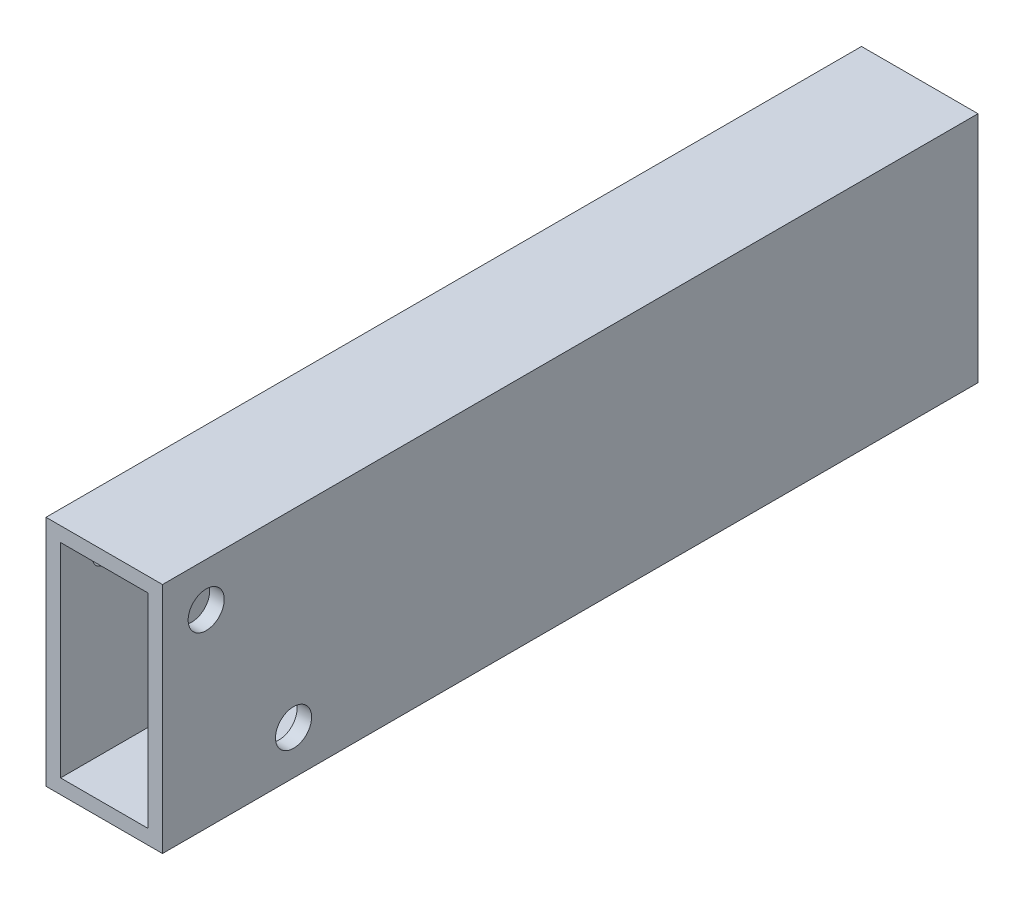
ISO-10303-21;
HEADER;
FILE_DESCRIPTION(('STEP AP214'),'2;1');
FILE_NAME('part.step','',(''),(''),'','','');
FILE_SCHEMA(('AUTOMOTIVE_DESIGN { 1 0 10303 214 1 1 1 1 }'));
ENDSEC;
DATA;
#1=APPLICATION_CONTEXT('core data for automotive mechanical design processes');
#2=APPLICATION_PROTOCOL_DEFINITION('international standard','automotive_design',2000,#1);
#3=PRODUCT_CONTEXT('',#1,'mechanical');
#4=PRODUCT('Part','Part','',(#3));
#5=PRODUCT_RELATED_PRODUCT_CATEGORY('part','',(#4));
#6=PRODUCT_DEFINITION_FORMATION('','',#4);
#7=PRODUCT_DEFINITION_CONTEXT('part definition',#1,'design');
#8=PRODUCT_DEFINITION('design','',#6,#7);
#9=PRODUCT_DEFINITION_SHAPE('','',#8);
#10=(LENGTH_UNIT() NAMED_UNIT(*) SI_UNIT(.MILLI.,.METRE.));
#11=(NAMED_UNIT(*) PLANE_ANGLE_UNIT() SI_UNIT($,.RADIAN.));
#12=(NAMED_UNIT(*) SI_UNIT($,.STERADIAN.) SOLID_ANGLE_UNIT());
#13=UNCERTAINTY_MEASURE_WITH_UNIT(LENGTH_MEASURE(1.E-05),#10,'distance_accuracy_value','');
#14=(GEOMETRIC_REPRESENTATION_CONTEXT(3) GLOBAL_UNCERTAINTY_ASSIGNED_CONTEXT((#13)) GLOBAL_UNIT_ASSIGNED_CONTEXT((#10,
#11,#12)) REPRESENTATION_CONTEXT('',''));
#15=CARTESIAN_POINT('',(0.,0.,0.));
#16=DIRECTION('',(0.,0.,1.));
#17=DIRECTION('',(1.,0.,0.));
#18=AXIS2_PLACEMENT_3D('',#15,#16,#17);
#19=CARTESIAN_POINT('',(0.,0.,177.8));
#20=DIRECTION('',(0.,0.,-1.));
#21=DIRECTION('',(-1.,0.,0.));
#22=AXIS2_PLACEMENT_3D('',#19,#20,#21);
#23=PLANE('',#22);
#24=DIRECTION('',(0.,1.,0.));
#25=VECTOR('',#24,1.);
#26=CARTESIAN_POINT('',(12.7,-25.4,177.8));
#27=LINE('',#26,#25);
#28=CARTESIAN_POINT('',(12.7,-25.4,177.8));
#29=VERTEX_POINT('',#28);
#30=CARTESIAN_POINT('',(12.7,25.4,177.8));
#31=VERTEX_POINT('',#30);
#32=EDGE_CURVE('E135',#29,#31,#27,.T.);
#33=ORIENTED_EDGE('',*,*,#32,.T.);
#34=DIRECTION('',(-1.,0.,0.));
#35=VECTOR('',#34,1.);
#36=CARTESIAN_POINT('',(-12.7,25.4,177.8));
#37=LINE('',#36,#35);
#38=CARTESIAN_POINT('',(-12.7,25.4,177.8));
#39=VERTEX_POINT('',#38);
#40=EDGE_CURVE('E138',#31,#39,#37,.T.);
#41=ORIENTED_EDGE('',*,*,#40,.T.);
#42=DIRECTION('',(0.,-1.,0.));
#43=VECTOR('',#42,1.);
#44=CARTESIAN_POINT('',(-12.7,-25.4,177.8));
#45=LINE('',#44,#43);
#46=CARTESIAN_POINT('',(-12.7,-25.4,177.8));
#47=VERTEX_POINT('',#46);
#48=EDGE_CURVE('E141',#39,#47,#45,.T.);
#49=ORIENTED_EDGE('',*,*,#48,.T.);
#50=DIRECTION('',(1.,0.,0.));
#51=VECTOR('',#50,1.);
#52=CARTESIAN_POINT('',(-12.7,-25.4,177.8));
#53=LINE('',#52,#51);
#54=EDGE_CURVE('E143',#47,#29,#53,.T.);
#55=ORIENTED_EDGE('',*,*,#54,.T.);
#56=EDGE_LOOP('',(#33,#41,#49,#55));
#57=FACE_BOUND('',#56,.T.);
#58=DIRECTION('',(0.,-1.,0.));
#59=VECTOR('',#58,1.);
#60=CARTESIAN_POINT('',(-9.525,-22.225,177.8));
#61=LINE('',#60,#59);
#62=CARTESIAN_POINT('',(-9.525,22.225,177.8));
#63=VERTEX_POINT('',#62);
#64=CARTESIAN_POINT('',(-9.525,-22.225,177.8));
#65=VERTEX_POINT('',#64);
#66=EDGE_CURVE('E97',#63,#65,#61,.T.);
#67=ORIENTED_EDGE('',*,*,#66,.F.);
#68=DIRECTION('',(-1.,0.,0.));
#69=VECTOR('',#68,1.);
#70=CARTESIAN_POINT('',(-9.525,22.225,177.8));
#71=LINE('',#70,#69);
#72=CARTESIAN_POINT('',(9.525,22.225,177.8));
#73=VERTEX_POINT('',#72);
#74=EDGE_CURVE('E119',#73,#63,#71,.T.);
#75=ORIENTED_EDGE('',*,*,#74,.F.);
#76=DIRECTION('',(0.,1.,0.));
#77=VECTOR('',#76,1.);
#78=CARTESIAN_POINT('',(9.525,-22.225,177.8));
#79=LINE('',#78,#77);
#80=CARTESIAN_POINT('',(9.525,-22.225,177.8));
#81=VERTEX_POINT('',#80);
#82=EDGE_CURVE('E117',#81,#73,#79,.T.);
#83=ORIENTED_EDGE('',*,*,#82,.F.);
#84=DIRECTION('',(1.,0.,0.));
#85=VECTOR('',#84,1.);
#86=CARTESIAN_POINT('',(-9.525,-22.225,177.8));
#87=LINE('',#86,#85);
#88=EDGE_CURVE('E105',#65,#81,#87,.T.);
#89=ORIENTED_EDGE('',*,*,#88,.F.);
#90=EDGE_LOOP('',(#67,#75,#83,#89));
#91=FACE_BOUND('',#90,.T.);
#92=ADVANCED_FACE('F32',(#57,#91),#23,.F.);
#93=CARTESIAN_POINT('',(0.,0.,0.));
#94=DIRECTION('',(0.,0.,-1.));
#95=DIRECTION('',(-1.,0.,0.));
#96=AXIS2_PLACEMENT_3D('',#93,#94,#95);
#97=PLANE('',#96);
#98=DIRECTION('',(0.,1.,0.));
#99=VECTOR('',#98,1.);
#100=CARTESIAN_POINT('',(12.7,-25.4,0.));
#101=LINE('',#100,#99);
#102=CARTESIAN_POINT('',(12.7,-25.4,0.));
#103=VERTEX_POINT('',#102);
#104=CARTESIAN_POINT('',(12.7,25.4,0.));
#105=VERTEX_POINT('',#104);
#106=EDGE_CURVE('E113',#103,#105,#101,.T.);
#107=ORIENTED_EDGE('',*,*,#106,.F.);
#108=DIRECTION('',(1.,0.,0.));
#109=VECTOR('',#108,1.);
#110=CARTESIAN_POINT('',(-12.7,-25.4,0.));
#111=LINE('',#110,#109);
#112=CARTESIAN_POINT('',(-12.7,-25.4,0.));
#113=VERTEX_POINT('',#112);
#114=EDGE_CURVE('E139',#113,#103,#111,.T.);
#115=ORIENTED_EDGE('',*,*,#114,.F.);
#116=DIRECTION('',(0.,-1.,0.));
#117=VECTOR('',#116,1.);
#118=CARTESIAN_POINT('',(-12.7,-25.4,0.));
#119=LINE('',#118,#117);
#120=CARTESIAN_POINT('',(-12.7,25.4,0.));
#121=VERTEX_POINT('',#120);
#122=EDGE_CURVE('E150',#121,#113,#119,.T.);
#123=ORIENTED_EDGE('',*,*,#122,.F.);
#124=DIRECTION('',(-1.,0.,0.));
#125=VECTOR('',#124,1.);
#126=CARTESIAN_POINT('',(-12.7,25.4,0.));
#127=LINE('',#126,#125);
#128=EDGE_CURVE('E148',#105,#121,#127,.T.);
#129=ORIENTED_EDGE('',*,*,#128,.F.);
#130=EDGE_LOOP('',(#107,#115,#123,#129));
#131=FACE_BOUND('',#130,.T.);
#132=DIRECTION('',(-1.,0.,0.));
#133=VECTOR('',#132,1.);
#134=CARTESIAN_POINT('',(-9.525,22.225,0.));
#135=LINE('',#134,#133);
#136=CARTESIAN_POINT('',(9.525,22.225,0.));
#137=VERTEX_POINT('',#136);
#138=CARTESIAN_POINT('',(-9.525,22.225,0.));
#139=VERTEX_POINT('',#138);
#140=EDGE_CURVE('E106',#137,#139,#135,.T.);
#141=ORIENTED_EDGE('',*,*,#140,.T.);
#142=DIRECTION('',(0.,-1.,0.));
#143=VECTOR('',#142,1.);
#144=CARTESIAN_POINT('',(-9.525,-22.225,0.));
#145=LINE('',#144,#143);
#146=CARTESIAN_POINT('',(-9.525,-22.225,0.));
#147=VERTEX_POINT('',#146);
#148=EDGE_CURVE('E55',#139,#147,#145,.T.);
#149=ORIENTED_EDGE('',*,*,#148,.T.);
#150=DIRECTION('',(1.,0.,0.));
#151=VECTOR('',#150,1.);
#152=CARTESIAN_POINT('',(-9.525,-22.225,0.));
#153=LINE('',#152,#151);
#154=CARTESIAN_POINT('',(9.525,-22.225,0.));
#155=VERTEX_POINT('',#154);
#156=EDGE_CURVE('E112',#147,#155,#153,.T.);
#157=ORIENTED_EDGE('',*,*,#156,.T.);
#158=DIRECTION('',(0.,1.,0.));
#159=VECTOR('',#158,1.);
#160=CARTESIAN_POINT('',(9.525,-22.225,0.));
#161=LINE('',#160,#159);
#162=EDGE_CURVE('E127',#155,#137,#161,.T.);
#163=ORIENTED_EDGE('',*,*,#162,.T.);
#164=EDGE_LOOP('',(#141,#149,#157,#163));
#165=FACE_BOUND('',#164,.T.);
#166=ADVANCED_FACE('F168',(#131,#165),#97,.T.);
#167=CARTESIAN_POINT('',(12.7,-25.4,177.8));
#168=DIRECTION('',(-1.,0.,0.));
#169=DIRECTION('',(0.,0.,1.));
#170=AXIS2_PLACEMENT_3D('',#167,#168,#169);
#171=PLANE('',#170);
#172=CARTESIAN_POINT('',(12.7,-15.875,149.225));
#173=DIRECTION('',(1.,0.,0.));
#174=DIRECTION('',(0.,0.,-1.));
#175=AXIS2_PLACEMENT_3D('',#172,#173,#174);
#176=CIRCLE('',#175,3.937);
#177=CARTESIAN_POINT('',(12.7,-15.875,145.288));
#178=VERTEX_POINT('',#177);
#179=EDGE_CURVE('E224',#178,#178,#176,.T.);
#180=ORIENTED_EDGE('',*,*,#179,.F.);
#181=EDGE_LOOP('',(#180));
#182=FACE_BOUND('',#181,.T.);
#183=CARTESIAN_POINT('',(12.7,15.875,168.275));
#184=DIRECTION('',(1.,0.,0.));
#185=DIRECTION('',(0.,0.,-1.));
#186=AXIS2_PLACEMENT_3D('',#183,#184,#185);
#187=CIRCLE('',#186,3.937);
#188=CARTESIAN_POINT('',(12.7,15.875,164.338));
#189=VERTEX_POINT('',#188);
#190=EDGE_CURVE('E220',#189,#189,#187,.T.);
#191=ORIENTED_EDGE('',*,*,#190,.F.);
#192=EDGE_LOOP('',(#191));
#193=FACE_BOUND('',#192,.T.);
#194=ORIENTED_EDGE('',*,*,#106,.T.);
#195=DIRECTION('',(0.,0.,-1.));
#196=VECTOR('',#195,1.);
#197=CARTESIAN_POINT('',(12.7,25.4,177.8));
#198=LINE('',#197,#196);
#199=EDGE_CURVE('E11',#31,#105,#198,.T.);
#200=ORIENTED_EDGE('',*,*,#199,.F.);
#201=ORIENTED_EDGE('',*,*,#32,.F.);
#202=DIRECTION('',(0.,0.,-1.));
#203=VECTOR('',#202,1.);
#204=CARTESIAN_POINT('',(12.7,-25.4,177.8));
#205=LINE('',#204,#203);
#206=EDGE_CURVE('E145',#29,#103,#205,.T.);
#207=ORIENTED_EDGE('',*,*,#206,.T.);
#208=EDGE_LOOP('',(#194,#200,#201,#207));
#209=FACE_BOUND('',#208,.T.);
#210=ADVANCED_FACE('F34',(#182,#193,#209),#171,.F.);
#211=CARTESIAN_POINT('',(-12.7,25.4,177.8));
#212=DIRECTION('',(0.,-1.,0.));
#213=DIRECTION('',(0.,0.,-1.));
#214=AXIS2_PLACEMENT_3D('',#211,#212,#213);
#215=PLANE('',#214);
#216=ORIENTED_EDGE('',*,*,#128,.T.);
#217=DIRECTION('',(0.,0.,-1.));
#218=VECTOR('',#217,1.);
#219=CARTESIAN_POINT('',(-12.7,25.4,177.8));
#220=LINE('',#219,#218);
#221=EDGE_CURVE('E40',#39,#121,#220,.T.);
#222=ORIENTED_EDGE('',*,*,#221,.F.);
#223=ORIENTED_EDGE('',*,*,#40,.F.);
#224=ORIENTED_EDGE('',*,*,#199,.T.);
#225=EDGE_LOOP('',(#216,#222,#223,#224));
#226=FACE_BOUND('',#225,.T.);
#227=ADVANCED_FACE('F178',(#226),#215,.F.);
#228=CARTESIAN_POINT('',(-12.7,-25.4,177.8));
#229=DIRECTION('',(1.,0.,0.));
#230=DIRECTION('',(0.,0.,-1.));
#231=AXIS2_PLACEMENT_3D('',#228,#229,#230);
#232=PLANE('',#231);
#233=CARTESIAN_POINT('',(-12.7,-15.875,149.225));
#234=DIRECTION('',(1.,0.,0.));
#235=DIRECTION('',(0.,0.,-1.));
#236=AXIS2_PLACEMENT_3D('',#233,#234,#235);
#237=CIRCLE('',#236,2.57968750000001);
#238=CARTESIAN_POINT('',(-12.7,-15.875,146.6453125));
#239=VERTEX_POINT('',#238);
#240=EDGE_CURVE('E217',#239,#239,#237,.T.);
#241=ORIENTED_EDGE('',*,*,#240,.T.);
#242=EDGE_LOOP('',(#241));
#243=FACE_BOUND('',#242,.T.);
#244=CARTESIAN_POINT('',(-12.7,15.875,168.275));
#245=DIRECTION('',(1.,0.,0.));
#246=DIRECTION('',(0.,0.,-1.));
#247=AXIS2_PLACEMENT_3D('',#244,#245,#246);
#248=CIRCLE('',#247,2.57968750000001);
#249=CARTESIAN_POINT('',(-12.7,15.875,165.6953125));
#250=VERTEX_POINT('',#249);
#251=EDGE_CURVE('E212',#250,#250,#248,.T.);
#252=ORIENTED_EDGE('',*,*,#251,.T.);
#253=EDGE_LOOP('',(#252));
#254=FACE_BOUND('',#253,.T.);
#255=ORIENTED_EDGE('',*,*,#122,.T.);
#256=DIRECTION('',(0.,0.,-1.));
#257=VECTOR('',#256,1.);
#258=CARTESIAN_POINT('',(-12.7,-25.4,177.8));
#259=LINE('',#258,#257);
#260=EDGE_CURVE('E155',#47,#113,#259,.T.);
#261=ORIENTED_EDGE('',*,*,#260,.F.);
#262=ORIENTED_EDGE('',*,*,#48,.F.);
#263=ORIENTED_EDGE('',*,*,#221,.T.);
#264=EDGE_LOOP('',(#255,#261,#262,#263));
#265=FACE_BOUND('',#264,.T.);
#266=ADVANCED_FACE('F162',(#243,#254,#265),#232,.F.);
#267=CARTESIAN_POINT('',(-12.7,-25.4,177.8));
#268=DIRECTION('',(0.,1.,0.));
#269=DIRECTION('',(0.,0.,1.));
#270=AXIS2_PLACEMENT_3D('',#267,#268,#269);
#271=PLANE('',#270);
#272=ORIENTED_EDGE('',*,*,#114,.T.);
#273=ORIENTED_EDGE('',*,*,#206,.F.);
#274=ORIENTED_EDGE('',*,*,#54,.F.);
#275=ORIENTED_EDGE('',*,*,#260,.T.);
#276=EDGE_LOOP('',(#272,#273,#274,#275));
#277=FACE_BOUND('',#276,.T.);
#278=ADVANCED_FACE('F172',(#277),#271,.F.);
#279=CARTESIAN_POINT('',(-9.525,-22.225,177.8));
#280=DIRECTION('',(1.,0.,0.));
#281=DIRECTION('',(0.,0.,-1.));
#282=AXIS2_PLACEMENT_3D('',#279,#280,#281);
#283=PLANE('',#282);
#284=CARTESIAN_POINT('',(-9.525,-15.875,149.225));
#285=DIRECTION('',(1.,0.,0.));
#286=DIRECTION('',(0.,0.,-1.));
#287=AXIS2_PLACEMENT_3D('',#284,#285,#286);
#288=CIRCLE('',#287,2.57968750000001);
#289=CARTESIAN_POINT('',(-9.525,-15.875,146.6453125));
#290=VERTEX_POINT('',#289);
#291=EDGE_CURVE('E208',#290,#290,#288,.T.);
#292=ORIENTED_EDGE('',*,*,#291,.F.);
#293=EDGE_LOOP('',(#292));
#294=FACE_BOUND('',#293,.T.);
#295=CARTESIAN_POINT('',(-9.525,15.875,168.275));
#296=DIRECTION('',(1.,0.,0.));
#297=DIRECTION('',(0.,0.,-1.));
#298=AXIS2_PLACEMENT_3D('',#295,#296,#297);
#299=CIRCLE('',#298,2.57968750000001);
#300=CARTESIAN_POINT('',(-9.525,15.875,165.6953125));
#301=VERTEX_POINT('',#300);
#302=EDGE_CURVE('E125',#301,#301,#299,.T.);
#303=ORIENTED_EDGE('',*,*,#302,.F.);
#304=EDGE_LOOP('',(#303));
#305=FACE_BOUND('',#304,.T.);
#306=ORIENTED_EDGE('',*,*,#148,.F.);
#307=DIRECTION('',(0.,0.,-1.));
#308=VECTOR('',#307,1.);
#309=CARTESIAN_POINT('',(-9.525,22.225,177.8));
#310=LINE('',#309,#308);
#311=EDGE_CURVE('E101',#63,#139,#310,.T.);
#312=ORIENTED_EDGE('',*,*,#311,.F.);
#313=ORIENTED_EDGE('',*,*,#66,.T.);
#314=DIRECTION('',(0.,0.,-1.));
#315=VECTOR('',#314,1.);
#316=CARTESIAN_POINT('',(-9.525,-22.225,177.8));
#317=LINE('',#316,#315);
#318=EDGE_CURVE('E100',#65,#147,#317,.T.);
#319=ORIENTED_EDGE('',*,*,#318,.T.);
#320=EDGE_LOOP('',(#306,#312,#313,#319));
#321=FACE_BOUND('',#320,.T.);
#322=ADVANCED_FACE('F99',(#294,#305,#321),#283,.T.);
#323=CARTESIAN_POINT('',(-9.525,-22.225,177.8));
#324=DIRECTION('',(0.,1.,0.));
#325=DIRECTION('',(0.,0.,1.));
#326=AXIS2_PLACEMENT_3D('',#323,#324,#325);
#327=PLANE('',#326);
#328=ORIENTED_EDGE('',*,*,#156,.F.);
#329=ORIENTED_EDGE('',*,*,#318,.F.);
#330=ORIENTED_EDGE('',*,*,#88,.T.);
#331=DIRECTION('',(0.,0.,-1.));
#332=VECTOR('',#331,1.);
#333=CARTESIAN_POINT('',(9.525,-22.225,177.8));
#334=LINE('',#333,#332);
#335=EDGE_CURVE('E114',#81,#155,#334,.T.);
#336=ORIENTED_EDGE('',*,*,#335,.T.);
#337=EDGE_LOOP('',(#328,#329,#330,#336));
#338=FACE_BOUND('',#337,.T.);
#339=ADVANCED_FACE('F109',(#338),#327,.T.);
#340=CARTESIAN_POINT('',(9.525,-22.225,177.8));
#341=DIRECTION('',(-1.,0.,0.));
#342=DIRECTION('',(0.,0.,1.));
#343=AXIS2_PLACEMENT_3D('',#340,#341,#342);
#344=PLANE('',#343);
#345=CARTESIAN_POINT('',(9.525,-15.875,149.225));
#346=DIRECTION('',(-1.,0.,0.));
#347=DIRECTION('',(0.,0.,1.));
#348=AXIS2_PLACEMENT_3D('',#345,#346,#347);
#349=CIRCLE('',#348,3.937);
#350=CARTESIAN_POINT('',(9.525,-15.875,145.288));
#351=VERTEX_POINT('',#350);
#352=EDGE_CURVE('E227',#351,#351,#349,.F.);
#353=ORIENTED_EDGE('',*,*,#352,.T.);
#354=EDGE_LOOP('',(#353));
#355=FACE_BOUND('',#354,.T.);
#356=CARTESIAN_POINT('',(9.525,15.875,168.275));
#357=DIRECTION('',(-1.,0.,0.));
#358=DIRECTION('',(0.,0.,1.));
#359=AXIS2_PLACEMENT_3D('',#356,#357,#358);
#360=CIRCLE('',#359,3.937);
#361=CARTESIAN_POINT('',(9.525,15.875,164.338));
#362=VERTEX_POINT('',#361);
#363=EDGE_CURVE('E221',#362,#362,#360,.F.);
#364=ORIENTED_EDGE('',*,*,#363,.T.);
#365=EDGE_LOOP('',(#364));
#366=FACE_BOUND('',#365,.T.);
#367=ORIENTED_EDGE('',*,*,#162,.F.);
#368=ORIENTED_EDGE('',*,*,#335,.F.);
#369=ORIENTED_EDGE('',*,*,#82,.T.);
#370=DIRECTION('',(0.,0.,-1.));
#371=VECTOR('',#370,1.);
#372=CARTESIAN_POINT('',(9.525,22.225,177.8));
#373=LINE('',#372,#371);
#374=EDGE_CURVE('E47',#73,#137,#373,.T.);
#375=ORIENTED_EDGE('',*,*,#374,.T.);
#376=EDGE_LOOP('',(#367,#368,#369,#375));
#377=FACE_BOUND('',#376,.T.);
#378=ADVANCED_FACE('F204',(#355,#366,#377),#344,.T.);
#379=CARTESIAN_POINT('',(-9.525,22.225,177.8));
#380=DIRECTION('',(0.,-1.,0.));
#381=DIRECTION('',(1.,0.,0.));
#382=AXIS2_PLACEMENT_3D('',#379,#380,#381);
#383=PLANE('',#382);
#384=ORIENTED_EDGE('',*,*,#140,.F.);
#385=ORIENTED_EDGE('',*,*,#374,.F.);
#386=ORIENTED_EDGE('',*,*,#74,.T.);
#387=ORIENTED_EDGE('',*,*,#311,.T.);
#388=EDGE_LOOP('',(#384,#385,#386,#387));
#389=FACE_BOUND('',#388,.T.);
#390=ADVANCED_FACE('F255',(#389),#383,.T.);
#391=CARTESIAN_POINT('',(-12.7,15.875,168.275));
#392=DIRECTION('',(1.,0.,0.));
#393=DIRECTION('',(0.,0.,-1.));
#394=AXIS2_PLACEMENT_3D('',#391,#392,#393);
#395=CYLINDRICAL_SURFACE('',#394,2.57968750000001);
#396=ORIENTED_EDGE('',*,*,#302,.T.);
#397=EDGE_LOOP('',(#396));
#398=FACE_BOUND('',#397,.T.);
#399=ORIENTED_EDGE('',*,*,#251,.F.);
#400=EDGE_LOOP('',(#399));
#401=FACE_BOUND('',#400,.T.);
#402=ADVANCED_FACE('F248',(#398,#401),#395,.F.);
#403=CARTESIAN_POINT('',(-12.7,-15.875,149.225));
#404=DIRECTION('',(1.,0.,0.));
#405=DIRECTION('',(0.,0.,-1.));
#406=AXIS2_PLACEMENT_3D('',#403,#404,#405);
#407=CYLINDRICAL_SURFACE('',#406,2.57968750000001);
#408=ORIENTED_EDGE('',*,*,#291,.T.);
#409=EDGE_LOOP('',(#408));
#410=FACE_BOUND('',#409,.T.);
#411=ORIENTED_EDGE('',*,*,#240,.F.);
#412=EDGE_LOOP('',(#411));
#413=FACE_BOUND('',#412,.T.);
#414=ADVANCED_FACE('F239',(#410,#413),#407,.F.);
#415=CARTESIAN_POINT('',(-12.701,15.875,168.275));
#416=DIRECTION('',(1.,0.,0.));
#417=DIRECTION('',(0.,0.,-1.));
#418=AXIS2_PLACEMENT_3D('',#415,#416,#417);
#419=CYLINDRICAL_SURFACE('',#418,3.937);
#420=CARTESIAN_POINT('',(9.525,15.875,164.338));
#421=CARTESIAN_POINT('',(9.55807291666667,15.875,164.338));
#422=CARTESIAN_POINT('',(9.59114583333333,15.875,164.338));
#423=CARTESIAN_POINT('',(9.65729166666667,15.875,164.338));
#424=CARTESIAN_POINT('',(9.69036458333333,15.875,164.338));
#425=CARTESIAN_POINT('',(9.75651041666666,15.875,164.338));
#426=CARTESIAN_POINT('',(9.78958333333333,15.875,164.338));
#427=CARTESIAN_POINT('',(9.85572916666666,15.875,164.338));
#428=CARTESIAN_POINT('',(9.88880208333333,15.875,164.338));
#429=CARTESIAN_POINT('',(9.95494791666666,15.875,164.338));
#430=CARTESIAN_POINT('',(9.98802083333333,15.875,164.338));
#431=CARTESIAN_POINT('',(10.0541666666667,15.875,164.338));
#432=CARTESIAN_POINT('',(10.0872395833333,15.875,164.338));
#433=CARTESIAN_POINT('',(10.1533854166667,15.875,164.338));
#434=CARTESIAN_POINT('',(10.1864583333333,15.875,164.338));
#435=CARTESIAN_POINT('',(10.2526041666667,15.875,164.338));
#436=CARTESIAN_POINT('',(10.2856770833333,15.875,164.338));
#437=CARTESIAN_POINT('',(10.3518229166667,15.875,164.338));
#438=CARTESIAN_POINT('',(10.3848958333333,15.875,164.338));
#439=CARTESIAN_POINT('',(10.4510416666667,15.875,164.338));
#440=CARTESIAN_POINT('',(10.4841145833333,15.875,164.338));
#441=CARTESIAN_POINT('',(10.5502604166667,15.875,164.338));
#442=CARTESIAN_POINT('',(10.5833333333333,15.875,164.338));
#443=CARTESIAN_POINT('',(10.6494791666667,15.875,164.338));
#444=CARTESIAN_POINT('',(10.6825520833333,15.875,164.338));
#445=CARTESIAN_POINT('',(10.7486979166667,15.875,164.338));
#446=CARTESIAN_POINT('',(10.7817708333333,15.875,164.338));
#447=CARTESIAN_POINT('',(10.8479166666667,15.875,164.338));
#448=CARTESIAN_POINT('',(10.8809895833333,15.875,164.338));
#449=CARTESIAN_POINT('',(10.9471354166667,15.875,164.338));
#450=CARTESIAN_POINT('',(10.9802083333333,15.875,164.338));
#451=CARTESIAN_POINT('',(11.0463541666667,15.875,164.338));
#452=CARTESIAN_POINT('',(11.0794270833333,15.875,164.338));
#453=CARTESIAN_POINT('',(11.1455729166667,15.875,164.338));
#454=CARTESIAN_POINT('',(11.1786458333333,15.875,164.338));
#455=CARTESIAN_POINT('',(11.2447916666667,15.875,164.338));
#456=CARTESIAN_POINT('',(11.2778645833333,15.875,164.338));
#457=CARTESIAN_POINT('',(11.3440104166667,15.875,164.338));
#458=CARTESIAN_POINT('',(11.3770833333333,15.875,164.338));
#459=CARTESIAN_POINT('',(11.4432291666667,15.875,164.338));
#460=CARTESIAN_POINT('',(11.4763020833333,15.875,164.338));
#461=CARTESIAN_POINT('',(11.5424479166667,15.875,164.338));
#462=CARTESIAN_POINT('',(11.5755208333333,15.875,164.338));
#463=CARTESIAN_POINT('',(11.6416666666667,15.875,164.338));
#464=CARTESIAN_POINT('',(11.6747395833333,15.875,164.338));
#465=CARTESIAN_POINT('',(11.7408854166667,15.875,164.338));
#466=CARTESIAN_POINT('',(11.7739583333333,15.875,164.338));
#467=CARTESIAN_POINT('',(11.8401041666667,15.875,164.338));
#468=CARTESIAN_POINT('',(11.8731770833333,15.875,164.338));
#469=CARTESIAN_POINT('',(11.9393229166667,15.875,164.338));
#470=CARTESIAN_POINT('',(11.9723958333333,15.875,164.338));
#471=CARTESIAN_POINT('',(12.0385416666667,15.875,164.338));
#472=CARTESIAN_POINT('',(12.0716145833333,15.875,164.338));
#473=CARTESIAN_POINT('',(12.1377604166667,15.875,164.338));
#474=CARTESIAN_POINT('',(12.1708333333333,15.875,164.338));
#475=CARTESIAN_POINT('',(12.2369791666667,15.875,164.338));
#476=CARTESIAN_POINT('',(12.2700520833333,15.875,164.338));
#477=CARTESIAN_POINT('',(12.3361979166667,15.875,164.338));
#478=CARTESIAN_POINT('',(12.3692708333333,15.875,164.338));
#479=CARTESIAN_POINT('',(12.4354166666667,15.875,164.338));
#480=CARTESIAN_POINT('',(12.4684895833333,15.875,164.338));
#481=CARTESIAN_POINT('',(12.5346354166667,15.875,164.338));
#482=CARTESIAN_POINT('',(12.5677083333333,15.875,164.338));
#483=CARTESIAN_POINT('',(12.6338541666667,15.875,164.338));
#484=CARTESIAN_POINT('',(12.6669270833333,15.875,164.338));
#485=CARTESIAN_POINT('',(12.7,15.875,164.338));
#486=B_SPLINE_CURVE_WITH_KNOTS('',3,(#420,#421,#422,#423,#424,#425,#426,#427,#428,#429,#430,
#431,#432,#433,#434,#435,#436,#437,#438,#439,#440,#441,#442,#443,#444,#445,#446,#447,#448,#449,
#450,#451,#452,#453,#454,#455,#456,#457,#458,#459,#460,#461,#462,#463,#464,#465,#466,#467,#468,
#469,#470,#471,#472,#473,#474,#475,#476,#477,#478,#479,#480,#481,#482,#483,#484,#485),
.UNSPECIFIED.,.F.,.F.,(4,2,2,2,2,2,2,2,2,2,2,2,2,2,2,2,2,2,2,2,2,2,2,2,2,2,2,2,2,2,2,2,4),(0.,
0.0992187500000012,0.198437499999999,0.29765625,0.396874999999998,0.496093749999999,0.5953125,
0.694531249999998,0.793749999999999,0.892968750000001,0.992187499999998,1.09140625,1.190625,
1.28984375,1.3890625,1.48828125,1.5875,1.68671875,1.7859375,1.88515625,1.984375,2.08359375,
2.1828125,2.28203125,2.38125,2.48046875,2.5796875,2.67890625,2.778125,2.87734375,2.9765625,
3.07578125,3.175),.UNSPECIFIED.);
#487=EDGE_CURVE('BSEAM237',#362,#189,#486,.T.);
#488=ORIENTED_EDGE('',*,*,#363,.F.);
#489=ORIENTED_EDGE('',*,*,#190,.T.);
#490=ORIENTED_EDGE('',*,*,#487,.T.);
#491=ORIENTED_EDGE('',*,*,#487,.F.);
#492=EDGE_LOOP('',(#488,#490,#489,#491));
#493=FACE_BOUND('',#492,.T.);
#494=ADVANCED_FACE('F237',(#493),#419,.F.);
#495=CARTESIAN_POINT('',(-12.701,-15.875,149.225));
#496=DIRECTION('',(1.,0.,0.));
#497=DIRECTION('',(0.,0.,-1.));
#498=AXIS2_PLACEMENT_3D('',#495,#496,#497);
#499=CYLINDRICAL_SURFACE('',#498,3.937);
#500=CARTESIAN_POINT('',(9.525,-15.875,145.288));
#501=CARTESIAN_POINT('',(9.55807291666667,-15.875,145.288));
#502=CARTESIAN_POINT('',(9.59114583333333,-15.875,145.288));
#503=CARTESIAN_POINT('',(9.65729166666667,-15.875,145.288));
#504=CARTESIAN_POINT('',(9.69036458333333,-15.875,145.288));
#505=CARTESIAN_POINT('',(9.75651041666666,-15.875,145.288));
#506=CARTESIAN_POINT('',(9.78958333333333,-15.875,145.288));
#507=CARTESIAN_POINT('',(9.85572916666666,-15.875,145.288));
#508=CARTESIAN_POINT('',(9.88880208333333,-15.875,145.288));
#509=CARTESIAN_POINT('',(9.95494791666666,-15.875,145.288));
#510=CARTESIAN_POINT('',(9.98802083333333,-15.875,145.288));
#511=CARTESIAN_POINT('',(10.0541666666667,-15.875,145.288));
#512=CARTESIAN_POINT('',(10.0872395833333,-15.875,145.288));
#513=CARTESIAN_POINT('',(10.1533854166667,-15.875,145.288));
#514=CARTESIAN_POINT('',(10.1864583333333,-15.875,145.288));
#515=CARTESIAN_POINT('',(10.2526041666667,-15.875,145.288));
#516=CARTESIAN_POINT('',(10.2856770833333,-15.875,145.288));
#517=CARTESIAN_POINT('',(10.3518229166667,-15.875,145.288));
#518=CARTESIAN_POINT('',(10.3848958333333,-15.875,145.288));
#519=CARTESIAN_POINT('',(10.4510416666667,-15.875,145.288));
#520=CARTESIAN_POINT('',(10.4841145833333,-15.875,145.288));
#521=CARTESIAN_POINT('',(10.5502604166667,-15.875,145.288));
#522=CARTESIAN_POINT('',(10.5833333333333,-15.875,145.288));
#523=CARTESIAN_POINT('',(10.6494791666667,-15.875,145.288));
#524=CARTESIAN_POINT('',(10.6825520833333,-15.875,145.288));
#525=CARTESIAN_POINT('',(10.7486979166667,-15.875,145.288));
#526=CARTESIAN_POINT('',(10.7817708333333,-15.875,145.288));
#527=CARTESIAN_POINT('',(10.8479166666667,-15.875,145.288));
#528=CARTESIAN_POINT('',(10.8809895833333,-15.875,145.288));
#529=CARTESIAN_POINT('',(10.9471354166667,-15.875,145.288));
#530=CARTESIAN_POINT('',(10.9802083333333,-15.875,145.288));
#531=CARTESIAN_POINT('',(11.0463541666667,-15.875,145.288));
#532=CARTESIAN_POINT('',(11.0794270833333,-15.875,145.288));
#533=CARTESIAN_POINT('',(11.1455729166667,-15.875,145.288));
#534=CARTESIAN_POINT('',(11.1786458333333,-15.875,145.288));
#535=CARTESIAN_POINT('',(11.2447916666667,-15.875,145.288));
#536=CARTESIAN_POINT('',(11.2778645833333,-15.875,145.288));
#537=CARTESIAN_POINT('',(11.3440104166667,-15.875,145.288));
#538=CARTESIAN_POINT('',(11.3770833333333,-15.875,145.288));
#539=CARTESIAN_POINT('',(11.4432291666667,-15.875,145.288));
#540=CARTESIAN_POINT('',(11.4763020833333,-15.875,145.288));
#541=CARTESIAN_POINT('',(11.5424479166667,-15.875,145.288));
#542=CARTESIAN_POINT('',(11.5755208333333,-15.875,145.288));
#543=CARTESIAN_POINT('',(11.6416666666667,-15.875,145.288));
#544=CARTESIAN_POINT('',(11.6747395833333,-15.875,145.288));
#545=CARTESIAN_POINT('',(11.7408854166667,-15.875,145.288));
#546=CARTESIAN_POINT('',(11.7739583333333,-15.875,145.288));
#547=CARTESIAN_POINT('',(11.8401041666667,-15.875,145.288));
#548=CARTESIAN_POINT('',(11.8731770833333,-15.875,145.288));
#549=CARTESIAN_POINT('',(11.9393229166667,-15.875,145.288));
#550=CARTESIAN_POINT('',(11.9723958333333,-15.875,145.288));
#551=CARTESIAN_POINT('',(12.0385416666667,-15.875,145.288));
#552=CARTESIAN_POINT('',(12.0716145833333,-15.875,145.288));
#553=CARTESIAN_POINT('',(12.1377604166667,-15.875,145.288));
#554=CARTESIAN_POINT('',(12.1708333333333,-15.875,145.288));
#555=CARTESIAN_POINT('',(12.2369791666667,-15.875,145.288));
#556=CARTESIAN_POINT('',(12.2700520833333,-15.875,145.288));
#557=CARTESIAN_POINT('',(12.3361979166667,-15.875,145.288));
#558=CARTESIAN_POINT('',(12.3692708333333,-15.875,145.288));
#559=CARTESIAN_POINT('',(12.4354166666667,-15.875,145.288));
#560=CARTESIAN_POINT('',(12.4684895833333,-15.875,145.288));
#561=CARTESIAN_POINT('',(12.5346354166667,-15.875,145.288));
#562=CARTESIAN_POINT('',(12.5677083333333,-15.875,145.288));
#563=CARTESIAN_POINT('',(12.6338541666667,-15.875,145.288));
#564=CARTESIAN_POINT('',(12.6669270833333,-15.875,145.288));
#565=CARTESIAN_POINT('',(12.7,-15.875,145.288));
#566=B_SPLINE_CURVE_WITH_KNOTS('',3,(#500,#501,#502,#503,#504,#505,#506,#507,#508,#509,#510,
#511,#512,#513,#514,#515,#516,#517,#518,#519,#520,#521,#522,#523,#524,#525,#526,#527,#528,#529,
#530,#531,#532,#533,#534,#535,#536,#537,#538,#539,#540,#541,#542,#543,#544,#545,#546,#547,#548,
#549,#550,#551,#552,#553,#554,#555,#556,#557,#558,#559,#560,#561,#562,#563,#564,#565),
.UNSPECIFIED.,.F.,.F.,(4,2,2,2,2,2,2,2,2,2,2,2,2,2,2,2,2,2,2,2,2,2,2,2,2,2,2,2,2,2,2,2,4),(0.,
0.0992187500000012,0.198437499999999,0.29765625,0.396874999999998,0.496093749999999,0.5953125,
0.694531249999998,0.793749999999999,0.892968750000001,0.992187499999998,1.09140625,1.190625,
1.28984375,1.3890625,1.48828125,1.5875,1.68671875,1.7859375,1.88515625,1.984375,2.08359375,
2.1828125,2.28203125,2.38125,2.48046875,2.5796875,2.67890625,2.778125,2.87734375,2.9765625,
3.07578125,3.175),.UNSPECIFIED.);
#567=EDGE_CURVE('BSEAM233',#351,#178,#566,.T.);
#568=ORIENTED_EDGE('',*,*,#352,.F.);
#569=ORIENTED_EDGE('',*,*,#179,.T.);
#570=ORIENTED_EDGE('',*,*,#567,.T.);
#571=ORIENTED_EDGE('',*,*,#567,.F.);
#572=EDGE_LOOP('',(#568,#570,#569,#571));
#573=FACE_BOUND('',#572,.T.);
#574=ADVANCED_FACE('F233',(#573),#499,.F.);
#575=CLOSED_SHELL('',(#92,#166,#210,#227,#266,#278,#322,#339,#378,#390,#402,#414,#494,#574));
#576=MANIFOLD_SOLID_BREP('B2',#575);
#577=ADVANCED_BREP_SHAPE_REPRESENTATION('',(#18,#576),#14);
#578=SHAPE_DEFINITION_REPRESENTATION(#9,#577);
ENDSEC;
END-ISO-10303-21;
